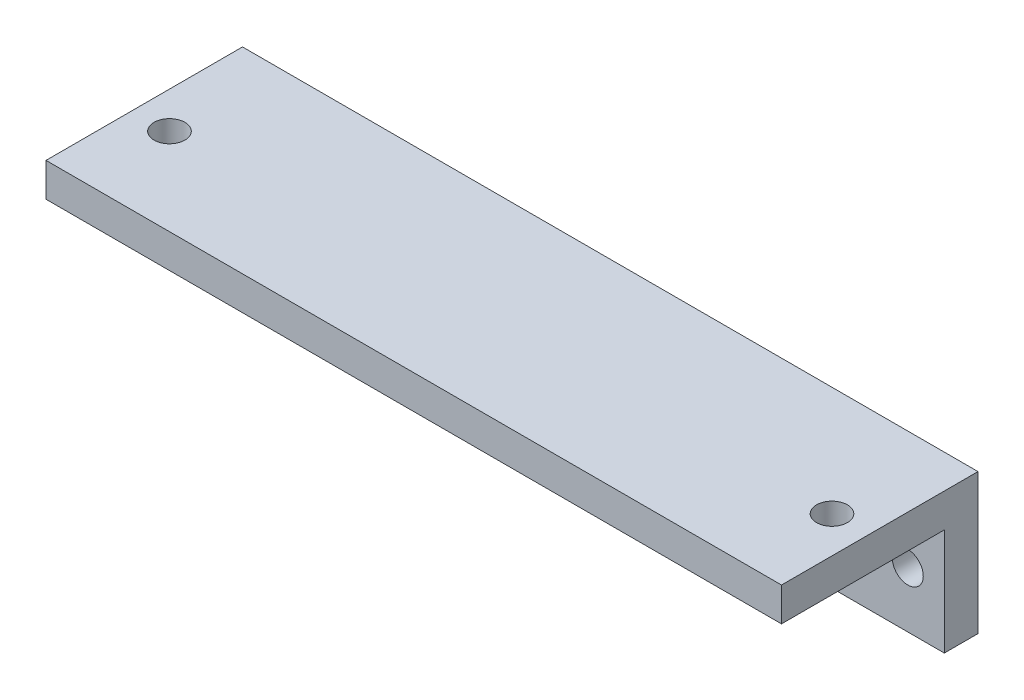
ISO-10303-21;
HEADER;
FILE_DESCRIPTION(('STEP AP214'),'2;1');
FILE_NAME('part.step','',(''),(''),'','','');
FILE_SCHEMA(('AUTOMOTIVE_DESIGN { 1 0 10303 214 1 1 1 1 }'));
ENDSEC;
DATA;
#1=APPLICATION_CONTEXT('core data for automotive mechanical design processes');
#2=APPLICATION_PROTOCOL_DEFINITION('international standard','automotive_design',2000,#1);
#3=PRODUCT_CONTEXT('',#1,'mechanical');
#4=PRODUCT('Part','Part','',(#3));
#5=PRODUCT_RELATED_PRODUCT_CATEGORY('part','',(#4));
#6=PRODUCT_DEFINITION_FORMATION('','',#4);
#7=PRODUCT_DEFINITION_CONTEXT('part definition',#1,'design');
#8=PRODUCT_DEFINITION('design','',#6,#7);
#9=PRODUCT_DEFINITION_SHAPE('','',#8);
#10=(LENGTH_UNIT() NAMED_UNIT(*) SI_UNIT(.MILLI.,.METRE.));
#11=(NAMED_UNIT(*) PLANE_ANGLE_UNIT() SI_UNIT($,.RADIAN.));
#12=(NAMED_UNIT(*) SI_UNIT($,.STERADIAN.) SOLID_ANGLE_UNIT());
#13=UNCERTAINTY_MEASURE_WITH_UNIT(LENGTH_MEASURE(1.E-05),#10,'distance_accuracy_value','');
#14=(GEOMETRIC_REPRESENTATION_CONTEXT(3) GLOBAL_UNCERTAINTY_ASSIGNED_CONTEXT((#13)) GLOBAL_UNIT_ASSIGNED_CONTEXT((#10,
#11,#12)) REPRESENTATION_CONTEXT('',''));
#15=CARTESIAN_POINT('',(0.,0.,0.));
#16=DIRECTION('',(0.,0.,1.));
#17=DIRECTION('',(1.,0.,0.));
#18=AXIS2_PLACEMENT_3D('',#15,#16,#17);
#19=CARTESIAN_POINT('',(-65.5,0.,6.));
#20=DIRECTION('',(0.,0.,1.));
#21=DIRECTION('',(1.,0.,0.));
#22=AXIS2_PLACEMENT_3D('',#19,#20,#21);
#23=PLANE('',#22);
#24=CARTESIAN_POINT('',(59.,-15.,6.));
#25=DIRECTION('',(0.,0.,1.));
#26=DIRECTION('',(1.,0.,0.));
#27=AXIS2_PLACEMENT_3D('',#24,#25,#26);
#28=CIRCLE('',#27,2.75);
#29=CARTESIAN_POINT('',(61.75,-15.,6.));
#30=VERTEX_POINT('',#29);
#31=EDGE_CURVE('E288',#30,#30,#28,.T.);
#32=ORIENTED_EDGE('',*,*,#31,.F.);
#33=EDGE_LOOP('',(#32));
#34=FACE_BOUND('',#33,.T.);
#35=CARTESIAN_POINT('',(-59.,-15.,6.));
#36=DIRECTION('',(0.,0.,1.));
#37=DIRECTION('',(1.,0.,0.));
#38=AXIS2_PLACEMENT_3D('',#35,#36,#37);
#39=CIRCLE('',#38,2.75);
#40=CARTESIAN_POINT('',(-56.25,-15.,6.));
#41=VERTEX_POINT('',#40);
#42=EDGE_CURVE('E300',#41,#41,#39,.T.);
#43=ORIENTED_EDGE('',*,*,#42,.F.);
#44=EDGE_LOOP('',(#43));
#45=FACE_BOUND('',#44,.T.);
#46=DIRECTION('',(0.,1.,0.));
#47=VECTOR('',#46,1.);
#48=CARTESIAN_POINT('',(65.5,0.,6.));
#49=LINE('',#48,#47);
#50=CARTESIAN_POINT('',(65.5,-25.,6.));
#51=VERTEX_POINT('',#50);
#52=CARTESIAN_POINT('',(65.5,-6.,6.));
#53=VERTEX_POINT('',#52);
#54=EDGE_CURVE('E60',#51,#53,#49,.T.);
#55=ORIENTED_EDGE('',*,*,#54,.T.);
#56=DIRECTION('',(-1.,0.,0.));
#57=VECTOR('',#56,1.);
#58=CARTESIAN_POINT('',(-65.5,-6.,6.));
#59=LINE('',#58,#57);
#60=CARTESIAN_POINT('',(-65.5,-6.,6.));
#61=VERTEX_POINT('',#60);
#62=EDGE_CURVE('E62',#53,#61,#59,.T.);
#63=ORIENTED_EDGE('',*,*,#62,.T.);
#64=DIRECTION('',(0.,-1.,0.));
#65=VECTOR('',#64,1.);
#66=CARTESIAN_POINT('',(-65.5,0.,6.));
#67=LINE('',#66,#65);
#68=CARTESIAN_POINT('',(-65.5,-25.,6.));
#69=VERTEX_POINT('',#68);
#70=EDGE_CURVE('E100',#61,#69,#67,.T.);
#71=ORIENTED_EDGE('',*,*,#70,.T.);
#72=DIRECTION('',(1.,0.,0.));
#73=VECTOR('',#72,1.);
#74=CARTESIAN_POINT('',(-65.5,-25.,6.));
#75=LINE('',#74,#73);
#76=EDGE_CURVE('E131',#69,#51,#75,.T.);
#77=ORIENTED_EDGE('',*,*,#76,.T.);
#78=EDGE_LOOP('',(#55,#63,#71,#77));
#79=FACE_BOUND('',#78,.T.);
#80=ADVANCED_FACE('F41',(#34,#45,#79),#23,.T.);
#81=CARTESIAN_POINT('',(-65.5,0.,6.));
#82=DIRECTION('',(1.,0.,0.));
#83=DIRECTION('',(0.,0.,-1.));
#84=AXIS2_PLACEMENT_3D('',#81,#82,#83);
#85=PLANE('',#84);
#86=DIRECTION('',(0.,-1.,0.));
#87=VECTOR('',#86,1.);
#88=CARTESIAN_POINT('',(-65.5,0.,0.));
#89=LINE('',#88,#87);
#90=CARTESIAN_POINT('',(-65.5,0.,0.));
#91=VERTEX_POINT('',#90);
#92=CARTESIAN_POINT('',(-65.5,-25.,0.));
#93=VERTEX_POINT('',#92);
#94=EDGE_CURVE('E134',#91,#93,#89,.T.);
#95=ORIENTED_EDGE('',*,*,#94,.T.);
#96=DIRECTION('',(0.,0.,-1.));
#97=VECTOR('',#96,1.);
#98=CARTESIAN_POINT('',(-65.5,-25.,6.));
#99=LINE('',#98,#97);
#100=EDGE_CURVE('E11',#69,#93,#99,.T.);
#101=ORIENTED_EDGE('',*,*,#100,.F.);
#102=ORIENTED_EDGE('',*,*,#70,.F.);
#103=DIRECTION('',(0.,0.,1.));
#104=VECTOR('',#103,1.);
#105=CARTESIAN_POINT('',(-65.5,-6.,0.));
#106=LINE('',#105,#104);
#107=CARTESIAN_POINT('',(-65.5,-6.,35.));
#108=VERTEX_POINT('',#107);
#109=EDGE_CURVE('E95',#61,#108,#106,.T.);
#110=ORIENTED_EDGE('',*,*,#109,.T.);
#111=DIRECTION('',(0.,1.,0.));
#112=VECTOR('',#111,1.);
#113=CARTESIAN_POINT('',(-65.5,-6.,35.));
#114=LINE('',#113,#112);
#115=CARTESIAN_POINT('',(-65.5,0.,35.));
#116=VERTEX_POINT('',#115);
#117=EDGE_CURVE('E98',#108,#116,#114,.T.);
#118=ORIENTED_EDGE('',*,*,#117,.T.);
#119=DIRECTION('',(0.,0.,-1.));
#120=VECTOR('',#119,1.);
#121=CARTESIAN_POINT('',(-65.5,0.,6.));
#122=LINE('',#121,#120);
#123=EDGE_CURVE('E142',#116,#91,#122,.T.);
#124=ORIENTED_EDGE('',*,*,#123,.T.);
#125=EDGE_LOOP('',(#95,#101,#102,#110,#118,#124));
#126=FACE_BOUND('',#125,.T.);
#127=ADVANCED_FACE('F43',(#126),#85,.F.);
#128=CARTESIAN_POINT('',(-65.5,-25.,6.));
#129=DIRECTION('',(0.,1.,0.));
#130=DIRECTION('',(-1.,0.,0.));
#131=AXIS2_PLACEMENT_3D('',#128,#129,#130);
#132=PLANE('',#131);
#133=DIRECTION('',(1.,0.,0.));
#134=VECTOR('',#133,1.);
#135=CARTESIAN_POINT('',(-65.5,-25.,0.));
#136=LINE('',#135,#134);
#137=CARTESIAN_POINT('',(65.5,-25.,0.));
#138=VERTEX_POINT('',#137);
#139=EDGE_CURVE('E144',#93,#138,#136,.T.);
#140=ORIENTED_EDGE('',*,*,#139,.T.);
#141=DIRECTION('',(0.,0.,-1.));
#142=VECTOR('',#141,1.);
#143=CARTESIAN_POINT('',(65.5,-25.,6.));
#144=LINE('',#143,#142);
#145=EDGE_CURVE('E49',#51,#138,#144,.T.);
#146=ORIENTED_EDGE('',*,*,#145,.F.);
#147=ORIENTED_EDGE('',*,*,#76,.F.);
#148=ORIENTED_EDGE('',*,*,#100,.T.);
#149=EDGE_LOOP('',(#140,#146,#147,#148));
#150=FACE_BOUND('',#149,.T.);
#151=ADVANCED_FACE('F173',(#150),#132,.F.);
#152=CARTESIAN_POINT('',(65.5,0.,6.));
#153=DIRECTION('',(-1.,0.,0.));
#154=DIRECTION('',(0.,0.,1.));
#155=AXIS2_PLACEMENT_3D('',#152,#153,#154);
#156=PLANE('',#155);
#157=DIRECTION('',(0.,0.,-1.));
#158=VECTOR('',#157,1.);
#159=CARTESIAN_POINT('',(65.5,0.,6.));
#160=LINE('',#159,#158);
#161=CARTESIAN_POINT('',(65.5,0.,35.));
#162=VERTEX_POINT('',#161);
#163=CARTESIAN_POINT('',(65.5,0.,0.));
#164=VERTEX_POINT('',#163);
#165=EDGE_CURVE('E155',#162,#164,#160,.T.);
#166=ORIENTED_EDGE('',*,*,#165,.F.);
#167=DIRECTION('',(0.,1.,0.));
#168=VECTOR('',#167,1.);
#169=CARTESIAN_POINT('',(65.5,-6.,35.));
#170=LINE('',#169,#168);
#171=CARTESIAN_POINT('',(65.5,-6.,35.));
#172=VERTEX_POINT('',#171);
#173=EDGE_CURVE('E115',#172,#162,#170,.T.);
#174=ORIENTED_EDGE('',*,*,#173,.F.);
#175=DIRECTION('',(0.,0.,-1.));
#176=VECTOR('',#175,1.);
#177=CARTESIAN_POINT('',(65.5,-6.,0.));
#178=LINE('',#177,#176);
#179=EDGE_CURVE('E113',#172,#53,#178,.T.);
#180=ORIENTED_EDGE('',*,*,#179,.T.);
#181=ORIENTED_EDGE('',*,*,#54,.F.);
#182=ORIENTED_EDGE('',*,*,#145,.T.);
#183=DIRECTION('',(0.,1.,0.));
#184=VECTOR('',#183,1.);
#185=CARTESIAN_POINT('',(65.5,0.,0.));
#186=LINE('',#185,#184);
#187=EDGE_CURVE('E150',#138,#164,#186,.T.);
#188=ORIENTED_EDGE('',*,*,#187,.T.);
#189=EDGE_LOOP('',(#166,#174,#180,#181,#182,#188));
#190=FACE_BOUND('',#189,.T.);
#191=ADVANCED_FACE('F161',(#190),#156,.F.);
#192=CARTESIAN_POINT('',(-65.5,0.,6.));
#193=DIRECTION('',(0.,-1.,0.));
#194=DIRECTION('',(0.,0.,-1.));
#195=AXIS2_PLACEMENT_3D('',#192,#193,#194);
#196=PLANE('',#195);
#197=CARTESIAN_POINT('',(59.,0.,19.5080976898657));
#198=DIRECTION('',(0.,-1.,0.));
#199=DIRECTION('',(0.,0.,-1.));
#200=AXIS2_PLACEMENT_3D('',#197,#198,#199);
#201=CIRCLE('',#200,2.75);
#202=CARTESIAN_POINT('',(59.,0.,16.7580976898657));
#203=VERTEX_POINT('',#202);
#204=EDGE_CURVE('E274',#203,#203,#201,.T.);
#205=ORIENTED_EDGE('',*,*,#204,.T.);
#206=EDGE_LOOP('',(#205));
#207=FACE_BOUND('',#206,.T.);
#208=CARTESIAN_POINT('',(-59.,0.,19.5080976898657));
#209=DIRECTION('',(0.,-1.,0.));
#210=DIRECTION('',(0.,0.,-1.));
#211=AXIS2_PLACEMENT_3D('',#208,#209,#210);
#212=CIRCLE('',#211,2.75);
#213=CARTESIAN_POINT('',(-59.,0.,16.7580976898657));
#214=VERTEX_POINT('',#213);
#215=EDGE_CURVE('E284',#214,#214,#212,.T.);
#216=ORIENTED_EDGE('',*,*,#215,.T.);
#217=EDGE_LOOP('',(#216));
#218=FACE_BOUND('',#217,.T.);
#219=DIRECTION('',(-1.,0.,0.));
#220=VECTOR('',#219,1.);
#221=CARTESIAN_POINT('',(-65.5,0.,0.));
#222=LINE('',#221,#220);
#223=EDGE_CURVE('E139',#164,#91,#222,.T.);
#224=ORIENTED_EDGE('',*,*,#223,.T.);
#225=ORIENTED_EDGE('',*,*,#123,.F.);
#226=DIRECTION('',(1.,0.,0.));
#227=VECTOR('',#226,1.);
#228=CARTESIAN_POINT('',(-65.5,0.,35.));
#229=LINE('',#228,#227);
#230=EDGE_CURVE('E104',#116,#162,#229,.T.);
#231=ORIENTED_EDGE('',*,*,#230,.T.);
#232=ORIENTED_EDGE('',*,*,#165,.T.);
#233=EDGE_LOOP('',(#224,#225,#231,#232));
#234=FACE_BOUND('',#233,.T.);
#235=ADVANCED_FACE('F175',(#207,#218,#234),#196,.F.);
#236=CARTESIAN_POINT('',(-65.5,0.,0.));
#237=DIRECTION('',(0.,0.,1.));
#238=DIRECTION('',(1.,0.,0.));
#239=AXIS2_PLACEMENT_3D('',#236,#237,#238);
#240=PLANE('',#239);
#241=CARTESIAN_POINT('',(59.,-15.,0.));
#242=DIRECTION('',(0.,0.,1.));
#243=DIRECTION('',(1.,0.,0.));
#244=AXIS2_PLACEMENT_3D('',#241,#242,#243);
#245=CIRCLE('',#244,2.75);
#246=CARTESIAN_POINT('',(61.75,-15.,0.));
#247=VERTEX_POINT('',#246);
#248=EDGE_CURVE('E291',#247,#247,#245,.T.);
#249=ORIENTED_EDGE('',*,*,#248,.T.);
#250=EDGE_LOOP('',(#249));
#251=FACE_BOUND('',#250,.T.);
#252=CARTESIAN_POINT('',(-59.,-15.,0.));
#253=DIRECTION('',(0.,0.,1.));
#254=DIRECTION('',(1.,0.,0.));
#255=AXIS2_PLACEMENT_3D('',#252,#253,#254);
#256=CIRCLE('',#255,2.75);
#257=CARTESIAN_POINT('',(-56.25,-15.,0.));
#258=VERTEX_POINT('',#257);
#259=EDGE_CURVE('E130',#258,#258,#256,.T.);
#260=ORIENTED_EDGE('',*,*,#259,.T.);
#261=EDGE_LOOP('',(#260));
#262=FACE_BOUND('',#261,.T.);
#263=ORIENTED_EDGE('',*,*,#223,.F.);
#264=ORIENTED_EDGE('',*,*,#187,.F.);
#265=ORIENTED_EDGE('',*,*,#139,.F.);
#266=ORIENTED_EDGE('',*,*,#94,.F.);
#267=EDGE_LOOP('',(#263,#264,#265,#266));
#268=FACE_BOUND('',#267,.T.);
#269=ADVANCED_FACE('F169',(#251,#262,#268),#240,.F.);
#270=CARTESIAN_POINT('',(-65.5,-6.,35.));
#271=DIRECTION('',(0.,0.,1.));
#272=DIRECTION('',(1.,0.,0.));
#273=AXIS2_PLACEMENT_3D('',#270,#271,#272);
#274=PLANE('',#273);
#275=ORIENTED_EDGE('',*,*,#230,.F.);
#276=ORIENTED_EDGE('',*,*,#117,.F.);
#277=DIRECTION('',(1.,0.,0.));
#278=VECTOR('',#277,1.);
#279=CARTESIAN_POINT('',(-65.5,-6.,35.));
#280=LINE('',#279,#278);
#281=EDGE_CURVE('E101',#108,#172,#280,.T.);
#282=ORIENTED_EDGE('',*,*,#281,.T.);
#283=ORIENTED_EDGE('',*,*,#173,.T.);
#284=EDGE_LOOP('',(#275,#276,#282,#283));
#285=FACE_BOUND('',#284,.T.);
#286=ADVANCED_FACE('F108',(#285),#274,.T.);
#287=CARTESIAN_POINT('',(-65.5,-6.,0.));
#288=DIRECTION('',(0.,1.,0.));
#289=DIRECTION('',(-1.,0.,0.));
#290=AXIS2_PLACEMENT_3D('',#287,#288,#289);
#291=PLANE('',#290);
#292=CARTESIAN_POINT('',(59.,-5.99999999980128,19.5080976898657));
#293=DIRECTION('',(0.,-1.,0.));
#294=DIRECTION('',(0.,0.,-1.));
#295=AXIS2_PLACEMENT_3D('',#292,#293,#294);
#296=CIRCLE('',#295,2.75);
#297=CARTESIAN_POINT('',(59.,-5.99999999980128,16.7580976898657));
#298=VERTEX_POINT('',#297);
#299=EDGE_CURVE('E272',#298,#298,#296,.T.);
#300=ORIENTED_EDGE('',*,*,#299,.F.);
#301=EDGE_LOOP('',(#300));
#302=FACE_BOUND('',#301,.T.);
#303=CARTESIAN_POINT('',(-59.,-5.99999999980128,19.5080976898657));
#304=DIRECTION('',(0.,-1.,0.));
#305=DIRECTION('',(0.,0.,-1.));
#306=AXIS2_PLACEMENT_3D('',#303,#304,#305);
#307=CIRCLE('',#306,2.75);
#308=CARTESIAN_POINT('',(-59.,-5.99999999980128,16.7580976898657));
#309=VERTEX_POINT('',#308);
#310=EDGE_CURVE('E277',#309,#309,#307,.T.);
#311=ORIENTED_EDGE('',*,*,#310,.F.);
#312=EDGE_LOOP('',(#311));
#313=FACE_BOUND('',#312,.T.);
#314=ORIENTED_EDGE('',*,*,#62,.F.);
#315=ORIENTED_EDGE('',*,*,#179,.F.);
#316=ORIENTED_EDGE('',*,*,#281,.F.);
#317=ORIENTED_EDGE('',*,*,#109,.F.);
#318=EDGE_LOOP('',(#314,#315,#316,#317));
#319=FACE_BOUND('',#318,.T.);
#320=ADVANCED_FACE('F116',(#302,#313,#319),#291,.F.);
#321=CARTESIAN_POINT('',(-59.,-15.,6.));
#322=DIRECTION('',(0.,0.,1.));
#323=DIRECTION('',(1.,0.,0.));
#324=AXIS2_PLACEMENT_3D('',#321,#322,#323);
#325=CYLINDRICAL_SURFACE('',#324,2.75);
#326=ORIENTED_EDGE('',*,*,#42,.T.);
#327=EDGE_LOOP('',(#326));
#328=FACE_BOUND('',#327,.T.);
#329=ORIENTED_EDGE('',*,*,#259,.F.);
#330=EDGE_LOOP('',(#329));
#331=FACE_BOUND('',#330,.T.);
#332=ADVANCED_FACE('F228',(#328,#331),#325,.F.);
#333=CARTESIAN_POINT('',(59.,-15.,6.));
#334=DIRECTION('',(0.,0.,1.));
#335=DIRECTION('',(1.,0.,0.));
#336=AXIS2_PLACEMENT_3D('',#333,#334,#335);
#337=CYLINDRICAL_SURFACE('',#336,2.75);
#338=ORIENTED_EDGE('',*,*,#31,.T.);
#339=EDGE_LOOP('',(#338));
#340=FACE_BOUND('',#339,.T.);
#341=ORIENTED_EDGE('',*,*,#248,.F.);
#342=EDGE_LOOP('',(#341));
#343=FACE_BOUND('',#342,.T.);
#344=ADVANCED_FACE('F236',(#340,#343),#337,.F.);
#345=CARTESIAN_POINT('',(-59.,-5.99999999980128,19.5080976898657));
#346=DIRECTION('',(0.,-1.,0.));
#347=DIRECTION('',(0.,0.,-1.));
#348=AXIS2_PLACEMENT_3D('',#345,#346,#347);
#349=CYLINDRICAL_SURFACE('',#348,2.75);
#350=ORIENTED_EDGE('',*,*,#310,.T.);
#351=EDGE_LOOP('',(#350));
#352=FACE_BOUND('',#351,.T.);
#353=ORIENTED_EDGE('',*,*,#215,.F.);
#354=EDGE_LOOP('',(#353));
#355=FACE_BOUND('',#354,.T.);
#356=ADVANCED_FACE('F246',(#352,#355),#349,.F.);
#357=CARTESIAN_POINT('',(59.,-5.99999999980128,19.5080976898657));
#358=DIRECTION('',(0.,-1.,0.));
#359=DIRECTION('',(0.,0.,-1.));
#360=AXIS2_PLACEMENT_3D('',#357,#358,#359);
#361=CYLINDRICAL_SURFACE('',#360,2.75);
#362=ORIENTED_EDGE('',*,*,#299,.T.);
#363=EDGE_LOOP('',(#362));
#364=FACE_BOUND('',#363,.T.);
#365=ORIENTED_EDGE('',*,*,#204,.F.);
#366=EDGE_LOOP('',(#365));
#367=FACE_BOUND('',#366,.T.);
#368=ADVANCED_FACE('F253',(#364,#367),#361,.F.);
#369=CLOSED_SHELL('',(#80,#127,#151,#191,#235,#269,#286,#320,#332,#344,#356,#368));
#370=MANIFOLD_SOLID_BREP('B2',#369);
#371=ADVANCED_BREP_SHAPE_REPRESENTATION('',(#18,#370),#14);
#372=SHAPE_DEFINITION_REPRESENTATION(#9,#371);
ENDSEC;
END-ISO-10303-21;
